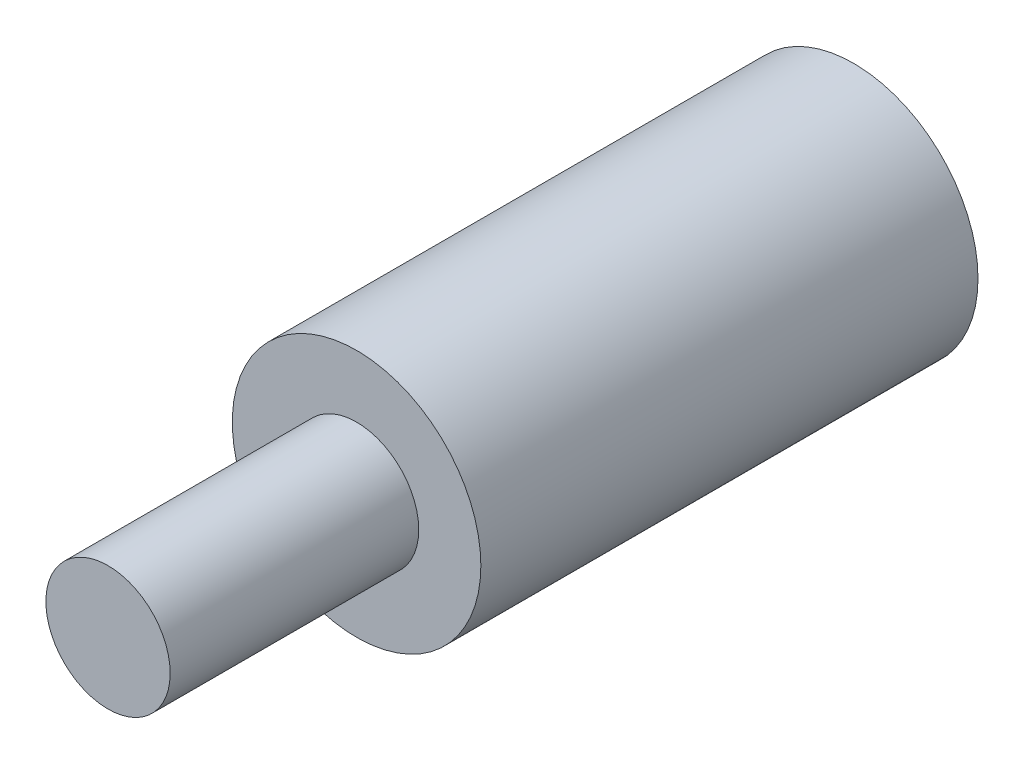
ISO-10303-21;
HEADER;
FILE_DESCRIPTION(('STEP AP214'),'2;1');
FILE_NAME('part.step','',(''),(''),'','','');
FILE_SCHEMA(('AUTOMOTIVE_DESIGN { 1 0 10303 214 1 1 1 1 }'));
ENDSEC;
DATA;
#1=APPLICATION_CONTEXT('core data for automotive mechanical design processes');
#2=APPLICATION_PROTOCOL_DEFINITION('international standard','automotive_design',2000,#1);
#3=PRODUCT_CONTEXT('',#1,'mechanical');
#4=PRODUCT('Part','Part','',(#3));
#5=PRODUCT_RELATED_PRODUCT_CATEGORY('part','',(#4));
#6=PRODUCT_DEFINITION_FORMATION('','',#4);
#7=PRODUCT_DEFINITION_CONTEXT('part definition',#1,'design');
#8=PRODUCT_DEFINITION('design','',#6,#7);
#9=PRODUCT_DEFINITION_SHAPE('','',#8);
#10=(LENGTH_UNIT() NAMED_UNIT(*) SI_UNIT(.MILLI.,.METRE.));
#11=(NAMED_UNIT(*) PLANE_ANGLE_UNIT() SI_UNIT($,.RADIAN.));
#12=(NAMED_UNIT(*) SI_UNIT($,.STERADIAN.) SOLID_ANGLE_UNIT());
#13=UNCERTAINTY_MEASURE_WITH_UNIT(LENGTH_MEASURE(1.E-05),#10,'distance_accuracy_value','');
#14=(GEOMETRIC_REPRESENTATION_CONTEXT(3) GLOBAL_UNCERTAINTY_ASSIGNED_CONTEXT((#13)) GLOBAL_UNIT_ASSIGNED_CONTEXT((#10,
#11,#12)) REPRESENTATION_CONTEXT('',''));
#15=CARTESIAN_POINT('',(0.,0.,0.));
#16=DIRECTION('',(0.,0.,1.));
#17=DIRECTION('',(1.,0.,0.));
#18=AXIS2_PLACEMENT_3D('',#15,#16,#17);
#19=CARTESIAN_POINT('',(0.,0.,20.));
#20=DIRECTION('',(0.,0.,-1.));
#21=DIRECTION('',(-1.,0.,0.));
#22=AXIS2_PLACEMENT_3D('',#19,#20,#21);
#23=CYLINDRICAL_SURFACE('',#22,5.);
#24=CARTESIAN_POINT('',(0.,0.,20.));
#25=DIRECTION('',(0.,0.,1.));
#26=DIRECTION('',(1.,0.,0.));
#27=AXIS2_PLACEMENT_3D('',#24,#25,#26);
#28=CIRCLE('',#27,5.);
#29=CARTESIAN_POINT('',(5.,0.,20.));
#30=VERTEX_POINT('',#29);
#31=EDGE_CURVE('E10',#30,#30,#28,.T.);
#32=ORIENTED_EDGE('',*,*,#31,.F.);
#33=EDGE_LOOP('',(#32));
#34=FACE_BOUND('',#33,.T.);
#35=CARTESIAN_POINT('',(0.,0.,0.));
#36=DIRECTION('',(0.,0.,1.));
#37=DIRECTION('',(1.,0.,0.));
#38=AXIS2_PLACEMENT_3D('',#35,#36,#37);
#39=CIRCLE('',#38,5.);
#40=CARTESIAN_POINT('',(5.,0.,0.));
#41=VERTEX_POINT('',#40);
#42=EDGE_CURVE('E20',#41,#41,#39,.T.);
#43=ORIENTED_EDGE('',*,*,#42,.T.);
#44=EDGE_LOOP('',(#43));
#45=FACE_BOUND('',#44,.T.);
#46=ADVANCED_FACE('F14',(#34,#45),#23,.T.);
#47=CARTESIAN_POINT('',(0.,0.,20.));
#48=DIRECTION('',(0.,0.,1.));
#49=DIRECTION('',(1.,0.,0.));
#50=AXIS2_PLACEMENT_3D('',#47,#48,#49);
#51=PLANE('',#50);
#52=ORIENTED_EDGE('',*,*,#31,.T.);
#53=EDGE_LOOP('',(#52));
#54=FACE_BOUND('',#53,.T.);
#55=ADVANCED_FACE('F49',(#54),#51,.T.);
#56=CARTESIAN_POINT('',(0.,0.,0.));
#57=DIRECTION('',(0.,0.,1.));
#58=DIRECTION('',(1.,0.,0.));
#59=AXIS2_PLACEMENT_3D('',#56,#57,#58);
#60=PLANE('',#59);
#61=CARTESIAN_POINT('',(0.,0.,0.));
#62=DIRECTION('',(0.,0.,1.));
#63=DIRECTION('',(1.,0.,0.));
#64=AXIS2_PLACEMENT_3D('',#61,#62,#63);
#65=CIRCLE('',#64,10.);
#66=CARTESIAN_POINT('',(10.,0.,0.));
#67=VERTEX_POINT('',#66);
#68=EDGE_CURVE('E29',#67,#67,#65,.T.);
#69=ORIENTED_EDGE('',*,*,#68,.T.);
#70=EDGE_LOOP('',(#69));
#71=FACE_BOUND('',#70,.T.);
#72=ORIENTED_EDGE('',*,*,#42,.F.);
#73=EDGE_LOOP('',(#72));
#74=FACE_BOUND('',#73,.T.);
#75=ADVANCED_FACE('F35',(#71,#74),#60,.T.);
#76=CARTESIAN_POINT('',(0.,0.,-40.));
#77=DIRECTION('',(0.,0.,1.));
#78=DIRECTION('',(1.,0.,0.));
#79=AXIS2_PLACEMENT_3D('',#76,#77,#78);
#80=CYLINDRICAL_SURFACE('',#79,10.);
#81=CARTESIAN_POINT('',(0.,0.,-40.));
#82=DIRECTION('',(0.,0.,1.));
#83=DIRECTION('',(1.,0.,0.));
#84=AXIS2_PLACEMENT_3D('',#81,#82,#83);
#85=CIRCLE('',#84,10.);
#86=CARTESIAN_POINT('',(10.,0.,-40.));
#87=VERTEX_POINT('',#86);
#88=EDGE_CURVE('E24',#87,#87,#85,.T.);
#89=ORIENTED_EDGE('',*,*,#88,.T.);
#90=EDGE_LOOP('',(#89));
#91=FACE_BOUND('',#90,.T.);
#92=ORIENTED_EDGE('',*,*,#68,.F.);
#93=EDGE_LOOP('',(#92));
#94=FACE_BOUND('',#93,.T.);
#95=ADVANCED_FACE('F40',(#91,#94),#80,.T.);
#96=CARTESIAN_POINT('',(0.,0.,-40.));
#97=DIRECTION('',(0.,0.,1.));
#98=DIRECTION('',(1.,0.,0.));
#99=AXIS2_PLACEMENT_3D('',#96,#97,#98);
#100=PLANE('',#99);
#101=ORIENTED_EDGE('',*,*,#88,.F.);
#102=EDGE_LOOP('',(#101));
#103=FACE_BOUND('',#102,.T.);
#104=ADVANCED_FACE('F39',(#103),#100,.F.);
#105=CLOSED_SHELL('',(#46,#55,#75,#95,#104));
#106=MANIFOLD_SOLID_BREP('B1',#105);
#107=ADVANCED_BREP_SHAPE_REPRESENTATION('',(#18,#106),#14);
#108=SHAPE_DEFINITION_REPRESENTATION(#9,#107);
ENDSEC;
END-ISO-10303-21;
